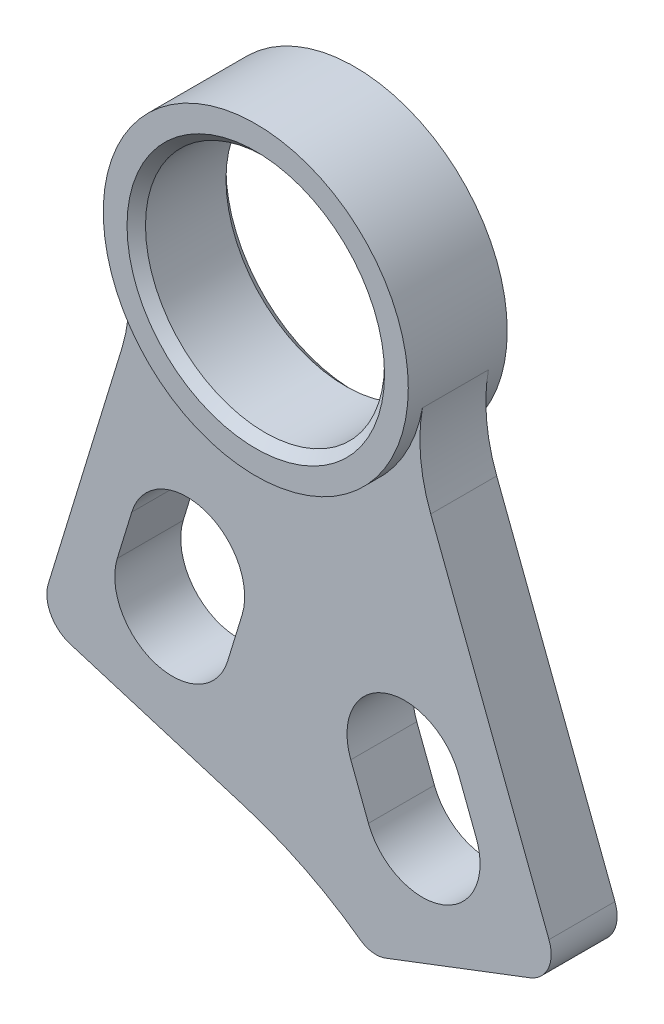
ISO-10303-21;
HEADER;
FILE_DESCRIPTION(('STEP AP214'),'2;1');
FILE_NAME('part.step','',(''),(''),'','','');
FILE_SCHEMA(('AUTOMOTIVE_DESIGN { 1 0 10303 214 1 1 1 1 }'));
ENDSEC;
DATA;
#1=APPLICATION_CONTEXT('core data for automotive mechanical design processes');
#2=APPLICATION_PROTOCOL_DEFINITION('international standard','automotive_design',2000,#1);
#3=PRODUCT_CONTEXT('',#1,'mechanical');
#4=PRODUCT('Part','Part','',(#3));
#5=PRODUCT_RELATED_PRODUCT_CATEGORY('part','',(#4));
#6=PRODUCT_DEFINITION_FORMATION('','',#4);
#7=PRODUCT_DEFINITION_CONTEXT('part definition',#1,'design');
#8=PRODUCT_DEFINITION('design','',#6,#7);
#9=PRODUCT_DEFINITION_SHAPE('','',#8);
#10=(LENGTH_UNIT() NAMED_UNIT(*) SI_UNIT(.MILLI.,.METRE.));
#11=(NAMED_UNIT(*) PLANE_ANGLE_UNIT() SI_UNIT($,.RADIAN.));
#12=(NAMED_UNIT(*) SI_UNIT($,.STERADIAN.) SOLID_ANGLE_UNIT());
#13=UNCERTAINTY_MEASURE_WITH_UNIT(LENGTH_MEASURE(1.E-05),#10,'distance_accuracy_value','');
#14=(GEOMETRIC_REPRESENTATION_CONTEXT(3) GLOBAL_UNCERTAINTY_ASSIGNED_CONTEXT((#13)) GLOBAL_UNIT_ASSIGNED_CONTEXT((#10,
#11,#12)) REPRESENTATION_CONTEXT('',''));
#15=CARTESIAN_POINT('',(0.,0.,0.));
#16=DIRECTION('',(0.,0.,1.));
#17=DIRECTION('',(1.,0.,0.));
#18=AXIS2_PLACEMENT_3D('',#15,#16,#17);
#19=CARTESIAN_POINT('',(0.,0.,4.7625));
#20=DIRECTION('',(0.,0.,-1.));
#21=DIRECTION('',(-1.,0.,0.));
#22=AXIS2_PLACEMENT_3D('',#19,#20,#21);
#23=CYLINDRICAL_SURFACE('',#22,11.5062);
#24=CARTESIAN_POINT('',(0.,0.,-3.87350000000004));
#25=DIRECTION('',(0.,0.,1.));
#26=DIRECTION('',(1.,0.,0.));
#27=AXIS2_PLACEMENT_3D('',#24,#25,#26);
#28=CIRCLE('',#27,11.5062);
#29=CARTESIAN_POINT('',(-11.5062,0.,-3.87350000000004));
#30=VERTEX_POINT('',#29);
#31=EDGE_CURVE('E53',#30,#30,#28,.F.);
#32=CARTESIAN_POINT('',(0.,0.,3.87349999999996));
#33=DIRECTION('',(0.,0.,1.));
#34=DIRECTION('',(1.,0.,0.));
#35=AXIS2_PLACEMENT_3D('',#32,#33,#34);
#36=CIRCLE('',#35,11.5062);
#37=CARTESIAN_POINT('',(-11.5062,0.,3.87349999999996));
#38=VERTEX_POINT('',#37);
#39=EDGE_CURVE('E438',#38,#38,#36,.T.);
#40=CARTESIAN_POINT('',(-11.5062,0.,-3.87350000000004));
#41=CARTESIAN_POINT('',(-11.5062,0.,-3.79280208333337));
#42=CARTESIAN_POINT('',(-11.5062,0.,-3.7121041666667));
#43=CARTESIAN_POINT('',(-11.5062,0.,-3.55070833333337));
#44=CARTESIAN_POINT('',(-11.5062,0.,-3.4700104166667));
#45=CARTESIAN_POINT('',(-11.5062,0.,-3.30861458333337));
#46=CARTESIAN_POINT('',(-11.5062,0.,-3.2279166666667));
#47=CARTESIAN_POINT('',(-11.5062,0.,-3.06652083333337));
#48=CARTESIAN_POINT('',(-11.5062,0.,-2.98582291666671));
#49=CARTESIAN_POINT('',(-11.5062,0.,-2.82442708333337));
#50=CARTESIAN_POINT('',(-11.5062,0.,-2.74372916666671));
#51=CARTESIAN_POINT('',(-11.5062,0.,-2.58233333333337));
#52=CARTESIAN_POINT('',(-11.5062,0.,-2.50163541666671));
#53=CARTESIAN_POINT('',(-11.5062,0.,-2.34023958333337));
#54=CARTESIAN_POINT('',(-11.5062,0.,-2.25954166666671));
#55=CARTESIAN_POINT('',(-11.5062,0.,-2.09814583333337));
#56=CARTESIAN_POINT('',(-11.5062,0.,-2.01744791666671));
#57=CARTESIAN_POINT('',(-11.5062,0.,-1.85605208333337));
#58=CARTESIAN_POINT('',(-11.5062,0.,-1.77535416666671));
#59=CARTESIAN_POINT('',(-11.5062,0.,-1.61395833333337));
#60=CARTESIAN_POINT('',(-11.5062,0.,-1.53326041666671));
#61=CARTESIAN_POINT('',(-11.5062,0.,-1.37186458333337));
#62=CARTESIAN_POINT('',(-11.5062,0.,-1.29116666666671));
#63=CARTESIAN_POINT('',(-11.5062,0.,-1.12977083333337));
#64=CARTESIAN_POINT('',(-11.5062,0.,-1.04907291666671));
#65=CARTESIAN_POINT('',(-11.5062,0.,-0.887677083333374));
#66=CARTESIAN_POINT('',(-11.5062,0.,-0.806979166666707));
#67=CARTESIAN_POINT('',(-11.5062,0.,-0.645583333333374));
#68=CARTESIAN_POINT('',(-11.5062,0.,-0.564885416666707));
#69=CARTESIAN_POINT('',(-11.5062,0.,-0.403489583333373));
#70=CARTESIAN_POINT('',(-11.5062,0.,-0.322791666666707));
#71=CARTESIAN_POINT('',(-11.5062,0.,-0.161395833333374));
#72=CARTESIAN_POINT('',(-11.5062,0.,-0.0806979166667072));
#73=CARTESIAN_POINT('',(-11.5062,0.,0.0806979166666259));
#74=CARTESIAN_POINT('',(-11.5062,0.,0.161395833333293));
#75=CARTESIAN_POINT('',(-11.5062,0.,0.322791666666626));
#76=CARTESIAN_POINT('',(-11.5062,0.,0.403489583333292));
#77=CARTESIAN_POINT('',(-11.5062,0.,0.564885416666625));
#78=CARTESIAN_POINT('',(-11.5062,0.,0.645583333333292));
#79=CARTESIAN_POINT('',(-11.5062,0.,0.806979166666625));
#80=CARTESIAN_POINT('',(-11.5062,0.,0.887677083333292));
#81=CARTESIAN_POINT('',(-11.5062,0.,1.04907291666662));
#82=CARTESIAN_POINT('',(-11.5062,0.,1.12977083333329));
#83=CARTESIAN_POINT('',(-11.5062,0.,1.29116666666662));
#84=CARTESIAN_POINT('',(-11.5062,0.,1.37186458333329));
#85=CARTESIAN_POINT('',(-11.5062,0.,1.53326041666662));
#86=CARTESIAN_POINT('',(-11.5062,0.,1.61395833333329));
#87=CARTESIAN_POINT('',(-11.5062,0.,1.77535416666662));
#88=CARTESIAN_POINT('',(-11.5062,0.,1.85605208333329));
#89=CARTESIAN_POINT('',(-11.5062,0.,2.01744791666662));
#90=CARTESIAN_POINT('',(-11.5062,0.,2.09814583333329));
#91=CARTESIAN_POINT('',(-11.5062,0.,2.25954166666662));
#92=CARTESIAN_POINT('',(-11.5062,0.,2.34023958333329));
#93=CARTESIAN_POINT('',(-11.5062,0.,2.50163541666662));
#94=CARTESIAN_POINT('',(-11.5062,0.,2.58233333333329));
#95=CARTESIAN_POINT('',(-11.5062,0.,2.74372916666662));
#96=CARTESIAN_POINT('',(-11.5062,0.,2.82442708333329));
#97=CARTESIAN_POINT('',(-11.5062,0.,2.98582291666662));
#98=CARTESIAN_POINT('',(-11.5062,0.,3.06652083333329));
#99=CARTESIAN_POINT('',(-11.5062,0.,3.22791666666662));
#100=CARTESIAN_POINT('',(-11.5062,0.,3.30861458333329));
#101=CARTESIAN_POINT('',(-11.5062,0.,3.47001041666662));
#102=CARTESIAN_POINT('',(-11.5062,0.,3.55070833333329));
#103=CARTESIAN_POINT('',(-11.5062,0.,3.71210416666662));
#104=CARTESIAN_POINT('',(-11.5062,0.,3.79280208333329));
#105=CARTESIAN_POINT('',(-11.5062,0.,3.87349999999996));
#106=B_SPLINE_CURVE_WITH_KNOTS('',3,(#40,#41,#42,#43,#44,#45,#46,#47,#48,#49,#50,#51,#52,#53,
#54,#55,#56,#57,#58,#59,#60,#61,#62,#63,#64,#65,#66,#67,#68,#69,#70,#71,#72,#73,#74,#75,#76,#77,
#78,#79,#80,#81,#82,#83,#84,#85,#86,#87,#88,#89,#90,#91,#92,#93,#94,#95,#96,#97,#98,#99,#100,
#101,#102,#103,#104,#105),.UNSPECIFIED.,.F.,.F.,(4,2,2,2,2,2,2,2,2,2,2,2,2,2,2,2,2,2,2,2,2,2,2,
2,2,2,2,2,2,2,2,2,4),(0.,0.24209375,0.4841875,0.726281249999999,0.968374999999999,1.21046875,
1.4525625,1.69465625,1.93675,2.17884375,2.4209375,2.66303125,2.905125,3.14721875,3.3893125,
3.63140625,3.8735,4.11559375,4.3576875,4.59978125,4.841875,5.08396875,5.32606249999999,
5.56815625,5.81024999999999,6.05234374999999,6.29443749999999,6.53653125,6.77862499999999,
7.02071874999999,7.26281249999999,7.50490624999999,7.74699999999999),.UNSPECIFIED.);
#107=EDGE_CURVE('BSEAM44',#30,#38,#106,.T.);
#108=ORIENTED_EDGE('',*,*,#31,.T.);
#109=ORIENTED_EDGE('',*,*,#39,.T.);
#110=ORIENTED_EDGE('',*,*,#107,.T.);
#111=ORIENTED_EDGE('',*,*,#107,.F.);
#112=EDGE_LOOP('',(#108,#110,#109,#111));
#113=FACE_BOUND('',#112,.T.);
#114=ADVANCED_FACE('F44',(#113),#23,.F.);
#115=CARTESIAN_POINT('',(0.,0.,4.7625));
#116=DIRECTION('',(0.,0.,-1.));
#117=DIRECTION('',(-1.,0.,0.));
#118=AXIS2_PLACEMENT_3D('',#115,#116,#117);
#119=CYLINDRICAL_SURFACE('',#118,14.6812);
#120=DIRECTION('',(0.,0.,-1.));
#121=VECTOR('',#120,1.);
#122=CARTESIAN_POINT('',(-14.2454230008891,-3.55043053244813,3.175));
#123=LINE('',#122,#121);
#124=CARTESIAN_POINT('',(-14.2454230008891,-3.55043053244813,3.175));
#125=VERTEX_POINT('',#124);
#126=CARTESIAN_POINT('',(-14.2454230008891,-3.55043053244813,-3.175));
#127=VERTEX_POINT('',#126);
#128=EDGE_CURVE('E363',#125,#127,#123,.T.);
#129=ORIENTED_EDGE('',*,*,#128,.F.);
#130=CARTESIAN_POINT('',(0.,0.,3.175));
#131=DIRECTION('',(0.,0.,1.));
#132=DIRECTION('',(1.,0.,0.));
#133=AXIS2_PLACEMENT_3D('',#130,#131,#132);
#134=CIRCLE('',#133,14.6812);
#135=CARTESIAN_POINT('',(14.4545745348815,-2.56961251077967,3.175));
#136=VERTEX_POINT('',#135);
#137=EDGE_CURVE('E288',#125,#136,#134,.T.);
#138=ORIENTED_EDGE('',*,*,#137,.T.);
#139=DIRECTION('',(0.,0.,-1.));
#140=VECTOR('',#139,1.);
#141=CARTESIAN_POINT('',(14.4545745348815,-2.56961251077968,3.175));
#142=LINE('',#141,#140);
#143=CARTESIAN_POINT('',(14.4545745348815,-2.56961251077968,-3.175));
#144=VERTEX_POINT('',#143);
#145=EDGE_CURVE('E368',#136,#144,#142,.T.);
#146=ORIENTED_EDGE('',*,*,#145,.T.);
#147=CARTESIAN_POINT('',(0.,0.,-3.175));
#148=DIRECTION('',(0.,0.,1.));
#149=DIRECTION('',(1.,0.,0.));
#150=AXIS2_PLACEMENT_3D('',#147,#148,#149);
#151=CIRCLE('',#150,14.6812);
#152=EDGE_CURVE('E349',#127,#144,#151,.T.);
#153=ORIENTED_EDGE('',*,*,#152,.F.);
#154=EDGE_LOOP('',(#129,#138,#146,#153));
#155=FACE_BOUND('',#154,.T.);
#156=CARTESIAN_POINT('',(0.,0.,4.7625));
#157=DIRECTION('',(0.,0.,1.));
#158=DIRECTION('',(1.,0.,0.));
#159=AXIS2_PLACEMENT_3D('',#156,#157,#158);
#160=CIRCLE('',#159,14.6812);
#161=CARTESIAN_POINT('',(14.6812,0.,4.7625));
#162=VERTEX_POINT('',#161);
#163=EDGE_CURVE('E403',#162,#162,#160,.T.);
#164=ORIENTED_EDGE('',*,*,#163,.F.);
#165=EDGE_LOOP('',(#164));
#166=FACE_BOUND('',#165,.T.);
#167=CARTESIAN_POINT('',(0.,0.,-4.7625));
#168=DIRECTION('',(0.,0.,1.));
#169=DIRECTION('',(1.,0.,0.));
#170=AXIS2_PLACEMENT_3D('',#167,#168,#169);
#171=CIRCLE('',#170,14.6812);
#172=CARTESIAN_POINT('',(14.6812,0.,-4.7625));
#173=VERTEX_POINT('',#172);
#174=EDGE_CURVE('E385',#173,#173,#171,.T.);
#175=ORIENTED_EDGE('',*,*,#174,.T.);
#176=EDGE_LOOP('',(#175));
#177=FACE_BOUND('',#176,.T.);
#178=ADVANCED_FACE('F461',(#155,#166,#177),#119,.T.);
#179=CARTESIAN_POINT('',(0.,0.,4.7625));
#180=DIRECTION('',(0.,0.,1.));
#181=DIRECTION('',(1.,0.,0.));
#182=AXIS2_PLACEMENT_3D('',#179,#180,#181);
#183=PLANE('',#182);
#184=CARTESIAN_POINT('',(0.,0.,4.7625));
#185=DIRECTION('',(0.,0.,1.));
#186=DIRECTION('',(1.,0.,0.));
#187=AXIS2_PLACEMENT_3D('',#184,#185,#186);
#188=CIRCLE('',#187,12.3952);
#189=CARTESIAN_POINT('',(12.3952,0.,4.7625));
#190=VERTEX_POINT('',#189);
#191=EDGE_CURVE('E11',#190,#190,#188,.F.);
#192=ORIENTED_EDGE('',*,*,#191,.T.);
#193=EDGE_LOOP('',(#192));
#194=FACE_BOUND('',#193,.T.);
#195=ORIENTED_EDGE('',*,*,#163,.T.);
#196=EDGE_LOOP('',(#195));
#197=FACE_BOUND('',#196,.T.);
#198=ADVANCED_FACE('F457',(#194,#197),#183,.T.);
#199=CARTESIAN_POINT('',(0.,0.,-4.7625));
#200=DIRECTION('',(0.,0.,1.));
#201=DIRECTION('',(1.,0.,0.));
#202=AXIS2_PLACEMENT_3D('',#199,#200,#201);
#203=PLANE('',#202);
#204=CARTESIAN_POINT('',(0.,0.,-4.7625));
#205=DIRECTION('',(0.,0.,1.));
#206=DIRECTION('',(1.,0.,0.));
#207=AXIS2_PLACEMENT_3D('',#204,#205,#206);
#208=CIRCLE('',#207,12.3952);
#209=CARTESIAN_POINT('',(12.3952,0.,-4.7625));
#210=VERTEX_POINT('',#209);
#211=EDGE_CURVE('E434',#210,#210,#208,.T.);
#212=ORIENTED_EDGE('',*,*,#211,.T.);
#213=EDGE_LOOP('',(#212));
#214=FACE_BOUND('',#213,.T.);
#215=ORIENTED_EDGE('',*,*,#174,.F.);
#216=EDGE_LOOP('',(#215));
#217=FACE_BOUND('',#216,.T.);
#218=ADVANCED_FACE('F453',(#214,#217),#203,.F.);
#219=CARTESIAN_POINT('',(-12.623119457076,-41.2936951019463,3.175));
#220=DIRECTION('',(0.29233718057146,0.9563153103739,0.));
#221=DIRECTION('',(-0.9563153103739,0.29233718057146,0.));
#222=AXIS2_PLACEMENT_3D('',#219,#220,#221);
#223=PLANE('',#222);
#224=DIRECTION('',(0.9563153103739,-0.29233718057146,0.));
#225=VECTOR('',#224,1.);
#226=CARTESIAN_POINT('',(-12.623119457076,-41.2936951019463,3.175));
#227=LINE('',#226,#225);
#228=CARTESIAN_POINT('',(-19.4547969555581,-39.2053113682394,3.175));
#229=VERTEX_POINT('',#228);
#230=CARTESIAN_POINT('',(-2.75514084815689,-44.3102493839675,3.175));
#231=VERTEX_POINT('',#230);
#232=EDGE_CURVE('E268',#229,#231,#227,.T.);
#233=ORIENTED_EDGE('',*,*,#232,.F.);
#234=DIRECTION('',(0.,0.,-1.));
#235=VECTOR('',#234,1.);
#236=CARTESIAN_POINT('',(-19.4547969555581,-39.2053113682394,3.175));
#237=LINE('',#236,#235);
#238=CARTESIAN_POINT('',(-19.4547969555581,-39.2053113682394,-3.175));
#239=VERTEX_POINT('',#238);
#240=EDGE_CURVE('E407',#229,#239,#237,.T.);
#241=ORIENTED_EDGE('',*,*,#240,.T.);
#242=DIRECTION('',(0.9563153103739,-0.29233718057146,0.));
#243=VECTOR('',#242,1.);
#244=CARTESIAN_POINT('',(-12.623119457076,-41.2936951019463,-3.175));
#245=LINE('',#244,#243);
#246=CARTESIAN_POINT('',(-2.75514084815689,-44.3102493839675,-3.175));
#247=VERTEX_POINT('',#246);
#248=EDGE_CURVE('E328',#239,#247,#245,.T.);
#249=ORIENTED_EDGE('',*,*,#248,.T.);
#250=DIRECTION('',(0.,0.,-1.));
#251=VECTOR('',#250,1.);
#252=CARTESIAN_POINT('',(-2.75514084815689,-44.3102493839675,3.175));
#253=LINE('',#252,#251);
#254=EDGE_CURVE('E381',#231,#247,#253,.T.);
#255=ORIENTED_EDGE('',*,*,#254,.F.);
#256=EDGE_LOOP('',(#233,#241,#249,#255));
#257=FACE_BOUND('',#256,.T.);
#258=ADVANCED_FACE('F456',(#257),#223,.F.);
#259=CARTESIAN_POINT('',(-13.8931874279295,-80.7458627092131,3.175));
#260=DIRECTION('',(0.,0.,-1.));
#261=DIRECTION('',(-1.,0.,0.));
#262=AXIS2_PLACEMENT_3D('',#259,#260,#261);
#263=CYLINDRICAL_SURFACE('',#262,38.1);
#264=CARTESIAN_POINT('',(-13.8931874279295,-80.7458627092131,-3.175));
#265=DIRECTION('',(0.,0.,1.));
#266=DIRECTION('',(1.,0.,0.));
#267=AXIS2_PLACEMENT_3D('',#264,#265,#266);
#268=CIRCLE('',#267,38.1);
#269=CARTESIAN_POINT('',(8.46862094202407,-49.8985042092448,-3.175));
#270=VERTEX_POINT('',#269);
#271=EDGE_CURVE('E331',#247,#270,#268,.F.);
#272=ORIENTED_EDGE('',*,*,#271,.T.);
#273=DIRECTION('',(0.,0.,-1.));
#274=VECTOR('',#273,1.);
#275=CARTESIAN_POINT('',(8.46862094202407,-49.8985042092448,3.175));
#276=LINE('',#275,#274);
#277=CARTESIAN_POINT('',(8.46862094202407,-49.8985042092448,3.175));
#278=VERTEX_POINT('',#277);
#279=EDGE_CURVE('E378',#278,#270,#276,.T.);
#280=ORIENTED_EDGE('',*,*,#279,.F.);
#281=CARTESIAN_POINT('',(-13.8931874279295,-80.7458627092131,3.175));
#282=DIRECTION('',(0.,0.,1.));
#283=DIRECTION('',(1.,0.,0.));
#284=AXIS2_PLACEMENT_3D('',#281,#282,#283);
#285=CIRCLE('',#284,38.1);
#286=EDGE_CURVE('E271',#231,#278,#285,.F.);
#287=ORIENTED_EDGE('',*,*,#286,.F.);
#288=ORIENTED_EDGE('',*,*,#254,.T.);
#289=EDGE_LOOP('',(#272,#280,#287,#288));
#290=FACE_BOUND('',#289,.T.);
#291=ADVANCED_FACE('F516',(#290),#263,.F.);
#292=CARTESIAN_POINT('',(9.97829056036936,-47.8159660189891,3.175));
#293=DIRECTION('',(0.,0.,-1.));
#294=DIRECTION('',(-1.,0.,0.));
#295=AXIS2_PLACEMENT_3D('',#292,#293,#294);
#296=CYLINDRICAL_SURFACE('',#295,2.57217178089416);
#297=CARTESIAN_POINT('',(9.97829056036936,-47.8159660189891,-3.175));
#298=DIRECTION('',(0.,0.,1.));
#299=DIRECTION('',(1.,0.,0.));
#300=AXIS2_PLACEMENT_3D('',#297,#298,#299);
#301=CIRCLE('',#300,2.57217178089416);
#302=CARTESIAN_POINT('',(10.8964085832782,-50.2186992473018,-3.175));
#303=VERTEX_POINT('',#302);
#304=EDGE_CURVE('E335',#303,#270,#301,.F.);
#305=ORIENTED_EDGE('',*,*,#304,.F.);
#306=DIRECTION('',(0.,0.,-1.));
#307=VECTOR('',#306,1.);
#308=CARTESIAN_POINT('',(10.8964085832782,-50.2186992473018,3.175));
#309=LINE('',#308,#307);
#310=CARTESIAN_POINT('',(10.8964085832782,-50.2186992473018,3.175));
#311=VERTEX_POINT('',#310);
#312=EDGE_CURVE('E375',#311,#303,#309,.T.);
#313=ORIENTED_EDGE('',*,*,#312,.F.);
#314=CARTESIAN_POINT('',(9.97829056036936,-47.8159660189891,3.175));
#315=DIRECTION('',(0.,0.,1.));
#316=DIRECTION('',(1.,0.,0.));
#317=AXIS2_PLACEMENT_3D('',#314,#315,#316);
#318=CIRCLE('',#317,2.57217178089416);
#319=EDGE_CURVE('E274',#311,#278,#318,.F.);
#320=ORIENTED_EDGE('',*,*,#319,.T.);
#321=ORIENTED_EDGE('',*,*,#279,.T.);
#322=EDGE_LOOP('',(#305,#313,#320,#321));
#323=FACE_BOUND('',#322,.T.);
#324=ADVANCED_FACE('F519',(#323),#296,.T.);
#325=CARTESIAN_POINT('',(18.1326907907967,-47.4536144533306,3.175));
#326=DIRECTION('',(-0.356942732102297,0.934126268766352,0.));
#327=DIRECTION('',(-0.934126268766353,-0.356942732102297,0.));
#328=AXIS2_PLACEMENT_3D('',#325,#326,#327);
#329=PLANE('',#328);
#330=DIRECTION('',(0.934126268766353,0.356942732102297,0.));
#331=VECTOR('',#330,1.);
#332=CARTESIAN_POINT('',(18.1326907907967,-47.4536144533306,-3.175));
#333=LINE('',#332,#331);
#334=CARTESIAN_POINT('',(24.8058553232948,-44.9037048108754,-3.175));
#335=VERTEX_POINT('',#334);
#336=EDGE_CURVE('E339',#303,#335,#333,.T.);
#337=ORIENTED_EDGE('',*,*,#336,.T.);
#338=DIRECTION('',(0.,0.,-1.));
#339=VECTOR('',#338,1.);
#340=CARTESIAN_POINT('',(24.8058553232948,-44.9037048108754,3.175));
#341=LINE('',#340,#339);
#342=CARTESIAN_POINT('',(24.8058553232948,-44.9037048108754,3.175));
#343=VERTEX_POINT('',#342);
#344=EDGE_CURVE('E74',#335,#343,#341,.F.);
#345=ORIENTED_EDGE('',*,*,#344,.T.);
#346=DIRECTION('',(0.934126268766353,0.356942732102297,0.));
#347=VECTOR('',#346,1.);
#348=CARTESIAN_POINT('',(18.1326907907967,-47.4536144533306,3.175));
#349=LINE('',#348,#347);
#350=EDGE_CURVE('E278',#311,#343,#349,.T.);
#351=ORIENTED_EDGE('',*,*,#350,.F.);
#352=ORIENTED_EDGE('',*,*,#312,.T.);
#353=EDGE_LOOP('',(#337,#345,#351,#352));
#354=FACE_BOUND('',#353,.T.);
#355=ADVANCED_FACE('F520',(#354),#329,.F.);
#356=CARTESIAN_POINT('',(9.63901543583132,3.68320281688001,3.175));
#357=DIRECTION('',(-0.934126268766353,-0.356942732102297,0.));
#358=DIRECTION('',(0.356942732102297,-0.934126268766353,0.));
#359=AXIS2_PLACEMENT_3D('',#356,#357,#358);
#360=PLANE('',#359);
#361=DIRECTION('',(-0.356942732102297,0.934126268766353,0.));
#362=VECTOR('',#361,1.);
#363=CARTESIAN_POINT('',(9.63901543583132,3.68320281688001,3.175));
#364=LINE('',#363,#362);
#365=CARTESIAN_POINT('',(26.6384130522032,-40.8045607331175,3.175));
#366=VERTEX_POINT('',#365);
#367=CARTESIAN_POINT('',(15.2552665308469,-11.0146386237978,3.175));
#368=VERTEX_POINT('',#367);
#369=EDGE_CURVE('E281',#366,#368,#364,.T.);
#370=ORIENTED_EDGE('',*,*,#369,.F.);
#371=DIRECTION('',(0.,0.,-1.));
#372=VECTOR('',#371,1.);
#373=CARTESIAN_POINT('',(26.6384130522032,-40.8045607331175,3.175));
#374=LINE('',#373,#372);
#375=CARTESIAN_POINT('',(26.6384130522032,-40.8045607331175,-3.175));
#376=VERTEX_POINT('',#375);
#377=EDGE_CURVE('E428',#366,#376,#374,.T.);
#378=ORIENTED_EDGE('',*,*,#377,.T.);
#379=DIRECTION('',(-0.356942732102297,0.934126268766353,0.));
#380=VECTOR('',#379,1.);
#381=CARTESIAN_POINT('',(9.63901543583132,3.68320281688001,-3.175));
#382=LINE('',#381,#380);
#383=CARTESIAN_POINT('',(15.2552665308469,-11.0146386237978,-3.175));
#384=VERTEX_POINT('',#383);
#385=EDGE_CURVE('E342',#376,#384,#382,.T.);
#386=ORIENTED_EDGE('',*,*,#385,.T.);
#387=DIRECTION('',(0.,0.,-1.));
#388=VECTOR('',#387,1.);
#389=CARTESIAN_POINT('',(15.2552665308469,-11.0146386237978,3.175));
#390=LINE('',#389,#388);
#391=EDGE_CURVE('E371',#368,#384,#390,.T.);
#392=ORIENTED_EDGE('',*,*,#391,.F.);
#393=EDGE_LOOP('',(#370,#378,#386,#392));
#394=FACE_BOUND('',#393,.T.);
#395=ADVANCED_FACE('F486',(#394),#360,.F.);
#396=CARTESIAN_POINT('',(30.0845210475113,-5.34817275167437,3.175));
#397=DIRECTION('',(0.,0.,-1.));
#398=DIRECTION('',(-1.,0.,0.));
#399=AXIS2_PLACEMENT_3D('',#396,#397,#398);
#400=CYLINDRICAL_SURFACE('',#399,15.8749999999984);
#401=CARTESIAN_POINT('',(30.0845210475113,-5.34817275167437,-3.175));
#402=DIRECTION('',(0.,0.,1.));
#403=DIRECTION('',(1.,0.,0.));
#404=AXIS2_PLACEMENT_3D('',#401,#402,#403);
#405=CIRCLE('',#404,15.8749999999984);
#406=EDGE_CURVE('E345',#384,#144,#405,.F.);
#407=ORIENTED_EDGE('',*,*,#406,.T.);
#408=ORIENTED_EDGE('',*,*,#145,.F.);
#409=CARTESIAN_POINT('',(30.0845210475113,-5.34817275167437,3.175));
#410=DIRECTION('',(0.,0.,1.));
#411=DIRECTION('',(1.,0.,0.));
#412=AXIS2_PLACEMENT_3D('',#409,#410,#411);
#413=CIRCLE('',#412,15.8749999999984);
#414=EDGE_CURVE('E284',#368,#136,#413,.F.);
#415=ORIENTED_EDGE('',*,*,#414,.F.);
#416=ORIENTED_EDGE('',*,*,#391,.T.);
#417=EDGE_LOOP('',(#407,#408,#415,#416));
#418=FACE_BOUND('',#417,.T.);
#419=ADVANCED_FACE('F494',(#418),#400,.F.);
#420=CARTESIAN_POINT('',(-29.6492108478697,-7.38956389365897,3.175));
#421=DIRECTION('',(0.,0.,-1.));
#422=DIRECTION('',(-1.,0.,0.));
#423=AXIS2_PLACEMENT_3D('',#420,#421,#422);
#424=CYLINDRICAL_SURFACE('',#423,15.8749999999984);
#425=CARTESIAN_POINT('',(-29.6492108478697,-7.38956389365897,-3.175));
#426=DIRECTION('',(0.,0.,1.));
#427=DIRECTION('',(1.,0.,0.));
#428=AXIS2_PLACEMENT_3D('',#425,#426,#427);
#429=CIRCLE('',#428,15.8749999999984);
#430=CARTESIAN_POINT('',(-14.4677052956855,-12.0304166352304,-3.175));
#431=VERTEX_POINT('',#430);
#432=EDGE_CURVE('E353',#431,#127,#429,.T.);
#433=ORIENTED_EDGE('',*,*,#432,.F.);
#434=DIRECTION('',(0.,0.,-1.));
#435=VECTOR('',#434,1.);
#436=CARTESIAN_POINT('',(-14.4677052956855,-12.0304166352304,3.175));
#437=LINE('',#436,#435);
#438=CARTESIAN_POINT('',(-14.4677052956855,-12.0304166352304,3.175));
#439=VERTEX_POINT('',#438);
#440=EDGE_CURVE('E360',#439,#431,#437,.T.);
#441=ORIENTED_EDGE('',*,*,#440,.F.);
#442=CARTESIAN_POINT('',(-29.6492108478697,-7.38956389365897,3.175));
#443=DIRECTION('',(0.,0.,1.));
#444=DIRECTION('',(1.,0.,0.));
#445=AXIS2_PLACEMENT_3D('',#442,#443,#444);
#446=CIRCLE('',#445,15.8749999999984);
#447=EDGE_CURVE('E291',#439,#125,#446,.T.);
#448=ORIENTED_EDGE('',*,*,#447,.T.);
#449=ORIENTED_EDGE('',*,*,#128,.T.);
#450=EDGE_LOOP('',(#433,#441,#448,#449));
#451=FACE_BOUND('',#450,.T.);
#452=ADVANCED_FACE('F500',(#451),#424,.F.);
#453=CARTESIAN_POINT('',(12.7495482122783,-33.3658226624966,3.175));
#454=DIRECTION('',(0.,0.,-1.));
#455=DIRECTION('',(-1.,0.,0.));
#456=AXIS2_PLACEMENT_3D('',#453,#454,#455);
#457=CYLINDRICAL_SURFACE('',#456,5.5562499999984);
#458=CARTESIAN_POINT('',(12.7495482122783,-33.3658226624966,-3.175));
#459=DIRECTION('',(0.,0.,1.));
#460=DIRECTION('',(1.,0.,0.));
#461=AXIS2_PLACEMENT_3D('',#458,#459,#460);
#462=CIRCLE('',#461,5.5562499999984);
#463=CARTESIAN_POINT('',(17.9397872931099,-31.3825596072538,-3.175));
#464=VERTEX_POINT('',#463);
#465=CARTESIAN_POINT('',(7.55930913144678,-35.3490857177394,-3.175));
#466=VERTEX_POINT('',#465);
#467=EDGE_CURVE('E313',#464,#466,#462,.T.);
#468=ORIENTED_EDGE('',*,*,#467,.F.);
#469=DIRECTION('',(0.,0.,-1.));
#470=VECTOR('',#469,1.);
#471=CARTESIAN_POINT('',(17.9397872931099,-31.3825596072538,3.175));
#472=LINE('',#471,#470);
#473=CARTESIAN_POINT('',(17.9397872931099,-31.3825596072538,3.175));
#474=VERTEX_POINT('',#473);
#475=EDGE_CURVE('E364',#474,#464,#472,.T.);
#476=ORIENTED_EDGE('',*,*,#475,.F.);
#477=CARTESIAN_POINT('',(12.7495482122783,-33.3658226624966,3.175));
#478=DIRECTION('',(0.,0.,1.));
#479=DIRECTION('',(1.,0.,0.));
#480=AXIS2_PLACEMENT_3D('',#477,#478,#479);
#481=CIRCLE('',#480,5.5562499999984);
#482=CARTESIAN_POINT('',(7.55930913144678,-35.3490857177394,3.175));
#483=VERTEX_POINT('',#482);
#484=EDGE_CURVE('E254',#474,#483,#481,.T.);
#485=ORIENTED_EDGE('',*,*,#484,.T.);
#486=DIRECTION('',(0.,0.,-1.));
#487=VECTOR('',#486,1.);
#488=CARTESIAN_POINT('',(7.55930913144678,-35.3490857177394,3.175));
#489=LINE('',#488,#487);
#490=EDGE_CURVE('E227',#483,#466,#489,.T.);
#491=ORIENTED_EDGE('',*,*,#490,.T.);
#492=EDGE_LOOP('',(#468,#476,#485,#491));
#493=FACE_BOUND('',#492,.T.);
#494=ADVANCED_FACE('F548',(#493),#457,.F.);
#495=CARTESIAN_POINT('',(5.19023908083157,1.98326305524282,3.175));
#496=DIRECTION('',(-0.934126268766353,-0.356942732102297,0.));
#497=DIRECTION('',(0.356942732102297,-0.934126268766353,0.));
#498=AXIS2_PLACEMENT_3D('',#495,#496,#497);
#499=PLANE('',#498);
#500=DIRECTION('',(-0.356942732102297,0.934126268766353,0.));
#501=VECTOR('',#500,1.);
#502=CARTESIAN_POINT('',(5.19023908083157,1.98326305524282,-3.175));
#503=LINE('',#502,#501);
#504=CARTESIAN_POINT('',(19.6397270547482,-35.8313359622565,-3.175));
#505=VERTEX_POINT('',#504);
#506=EDGE_CURVE('E316',#505,#464,#503,.T.);
#507=ORIENTED_EDGE('',*,*,#506,.F.);
#508=DIRECTION('',(0.,0.,-1.));
#509=VECTOR('',#508,1.);
#510=CARTESIAN_POINT('',(19.6397270547482,-35.8313359622565,3.175));
#511=LINE('',#510,#509);
#512=CARTESIAN_POINT('',(19.6397270547482,-35.8313359622565,3.175));
#513=VERTEX_POINT('',#512);
#514=EDGE_CURVE('E391',#513,#505,#511,.T.);
#515=ORIENTED_EDGE('',*,*,#514,.F.);
#516=DIRECTION('',(-0.356942732102297,0.934126268766353,0.));
#517=VECTOR('',#516,1.);
#518=CARTESIAN_POINT('',(5.19023908083157,1.98326305524282,3.175));
#519=LINE('',#518,#517);
#520=EDGE_CURVE('E258',#513,#474,#519,.T.);
#521=ORIENTED_EDGE('',*,*,#520,.T.);
#522=ORIENTED_EDGE('',*,*,#475,.T.);
#523=EDGE_LOOP('',(#507,#515,#521,#522));
#524=FACE_BOUND('',#523,.T.);
#525=ADVANCED_FACE('F544',(#524),#499,.T.);
#526=CARTESIAN_POINT('',(14.4494879739167,-37.8145990174993,3.175));
#527=DIRECTION('',(0.,0.,-1.));
#528=DIRECTION('',(-1.,0.,0.));
#529=AXIS2_PLACEMENT_3D('',#526,#527,#528);
#530=CYLINDRICAL_SURFACE('',#529,5.5562499999984);
#531=CARTESIAN_POINT('',(14.4494879739167,-37.8145990174993,-3.175));
#532=DIRECTION('',(0.,0.,1.));
#533=DIRECTION('',(1.,0.,0.));
#534=AXIS2_PLACEMENT_3D('',#531,#532,#533);
#535=CIRCLE('',#534,5.5562499999984);
#536=CARTESIAN_POINT('',(9.25924889308512,-39.7978620727422,-3.175));
#537=VERTEX_POINT('',#536);
#538=EDGE_CURVE('E320',#537,#505,#535,.T.);
#539=ORIENTED_EDGE('',*,*,#538,.F.);
#540=DIRECTION('',(0.,0.,-1.));
#541=VECTOR('',#540,1.);
#542=CARTESIAN_POINT('',(9.25924889308512,-39.7978620727422,3.175));
#543=LINE('',#542,#541);
#544=CARTESIAN_POINT('',(9.25924889308512,-39.7978620727422,3.175));
#545=VERTEX_POINT('',#544);
#546=EDGE_CURVE('E388',#545,#537,#543,.T.);
#547=ORIENTED_EDGE('',*,*,#546,.F.);
#548=CARTESIAN_POINT('',(14.4494879739167,-37.8145990174993,3.175));
#549=DIRECTION('',(0.,0.,1.));
#550=DIRECTION('',(1.,0.,0.));
#551=AXIS2_PLACEMENT_3D('',#548,#549,#550);
#552=CIRCLE('',#551,5.5562499999984);
#553=EDGE_CURVE('E261',#545,#513,#552,.T.);
#554=ORIENTED_EDGE('',*,*,#553,.T.);
#555=ORIENTED_EDGE('',*,*,#514,.T.);
#556=EDGE_LOOP('',(#539,#547,#554,#555));
#557=FACE_BOUND('',#556,.T.);
#558=ADVANCED_FACE('F541',(#557),#530,.F.);
#559=CARTESIAN_POINT('',(-8.21430935258181,-26.871264827367,3.175));
#560=DIRECTION('',(0.,0.,-1.));
#561=DIRECTION('',(-1.,0.,0.));
#562=AXIS2_PLACEMENT_3D('',#559,#560,#561);
#563=CYLINDRICAL_SURFACE('',#562,5.5562499999984);
#564=CARTESIAN_POINT('',(-8.21430935258181,-26.871264827367,-3.175));
#565=DIRECTION('',(0.,0.,1.));
#566=DIRECTION('',(1.,0.,0.));
#567=AXIS2_PLACEMENT_3D('',#564,#565,#566);
#568=CIRCLE('',#567,5.5562499999984);
#569=CARTESIAN_POINT('',(-2.90078240931836,-28.4955632869167,-3.175));
#570=VERTEX_POINT('',#569);
#571=CARTESIAN_POINT('',(-13.5278362958453,-25.2469663678173,-3.175));
#572=VERTEX_POINT('',#571);
#573=EDGE_CURVE('E221',#570,#572,#568,.T.);
#574=ORIENTED_EDGE('',*,*,#573,.F.);
#575=DIRECTION('',(0.,0.,-1.));
#576=VECTOR('',#575,1.);
#577=CARTESIAN_POINT('',(-2.90078240931836,-28.4955632869167,3.175));
#578=LINE('',#577,#576);
#579=CARTESIAN_POINT('',(-2.90078240931836,-28.4955632869167,3.175));
#580=VERTEX_POINT('',#579);
#581=EDGE_CURVE('E216',#580,#570,#578,.T.);
#582=ORIENTED_EDGE('',*,*,#581,.F.);
#583=CARTESIAN_POINT('',(-8.21430935258181,-26.871264827367,3.175));
#584=DIRECTION('',(0.,0.,1.));
#585=DIRECTION('',(1.,0.,0.));
#586=AXIS2_PLACEMENT_3D('',#583,#584,#585);
#587=CIRCLE('',#586,5.5562499999984);
#588=CARTESIAN_POINT('',(-13.5278362958453,-25.2469663678173,3.175));
#589=VERTEX_POINT('',#588);
#590=EDGE_CURVE('E219',#580,#589,#587,.T.);
#591=ORIENTED_EDGE('',*,*,#590,.T.);
#592=DIRECTION('',(0.,0.,-1.));
#593=VECTOR('',#592,1.);
#594=CARTESIAN_POINT('',(-13.5278362958453,-25.2469663678173,3.175));
#595=LINE('',#594,#593);
#596=EDGE_CURVE('E299',#589,#572,#595,.T.);
#597=ORIENTED_EDGE('',*,*,#596,.T.);
#598=EDGE_LOOP('',(#574,#582,#591,#597));
#599=FACE_BOUND('',#598,.T.);
#600=ADVANCED_FACE('F218',(#599),#563,.F.);
#601=CARTESIAN_POINT('',(5.31352694326345,-1.62429845954971,3.175));
#602=DIRECTION('',(-0.9563153103739,0.29233718057146,0.));
#603=DIRECTION('',(-0.29233718057146,-0.9563153103739,0.));
#604=AXIS2_PLACEMENT_3D('',#601,#602,#603);
#605=PLANE('',#604);
#606=DIRECTION('',(0.29233718057146,0.9563153103739,0.));
#607=VECTOR('',#606,1.);
#608=CARTESIAN_POINT('',(5.31352694326345,-1.62429845954971,-3.175));
#609=LINE('',#608,#607);
#610=CARTESIAN_POINT('',(-4.29303823179089,-33.0500149525755,-3.175));
#611=VERTEX_POINT('',#610);
#612=EDGE_CURVE('E302',#611,#570,#609,.T.);
#613=ORIENTED_EDGE('',*,*,#612,.F.);
#614=DIRECTION('',(0.,0.,-1.));
#615=VECTOR('',#614,1.);
#616=CARTESIAN_POINT('',(-4.29303823179089,-33.0500149525755,3.175));
#617=LINE('',#616,#615);
#618=CARTESIAN_POINT('',(-4.29303823179089,-33.0500149525755,3.175));
#619=VERTEX_POINT('',#618);
#620=EDGE_CURVE('E228',#619,#611,#617,.T.);
#621=ORIENTED_EDGE('',*,*,#620,.F.);
#622=DIRECTION('',(0.29233718057146,0.9563153103739,0.));
#623=VECTOR('',#622,1.);
#624=CARTESIAN_POINT('',(5.31352694326345,-1.62429845954971,3.175));
#625=LINE('',#624,#623);
#626=EDGE_CURVE('E235',#619,#580,#625,.T.);
#627=ORIENTED_EDGE('',*,*,#626,.T.);
#628=ORIENTED_EDGE('',*,*,#581,.T.);
#629=EDGE_LOOP('',(#613,#621,#627,#628));
#630=FACE_BOUND('',#629,.T.);
#631=ADVANCED_FACE('F243',(#630),#605,.T.);
#632=CARTESIAN_POINT('',(-9.60656517505433,-31.4257164930258,3.175));
#633=DIRECTION('',(0.,0.,-1.));
#634=DIRECTION('',(-1.,0.,0.));
#635=AXIS2_PLACEMENT_3D('',#632,#633,#634);
#636=CYLINDRICAL_SURFACE('',#635,5.5562499999984);
#637=CARTESIAN_POINT('',(-9.60656517505433,-31.4257164930258,-3.175));
#638=DIRECTION('',(0.,0.,1.));
#639=DIRECTION('',(1.,0.,0.));
#640=AXIS2_PLACEMENT_3D('',#637,#638,#639);
#641=CIRCLE('',#640,5.5562499999984);
#642=CARTESIAN_POINT('',(-14.9200921183178,-29.8014180334761,-3.175));
#643=VERTEX_POINT('',#642);
#644=EDGE_CURVE('E305',#643,#611,#641,.T.);
#645=ORIENTED_EDGE('',*,*,#644,.F.);
#646=DIRECTION('',(0.,0.,-1.));
#647=VECTOR('',#646,1.);
#648=CARTESIAN_POINT('',(-14.9200921183178,-29.8014180334761,3.175));
#649=LINE('',#648,#647);
#650=CARTESIAN_POINT('',(-14.9200921183178,-29.8014180334761,3.175));
#651=VERTEX_POINT('',#650);
#652=EDGE_CURVE('E398',#651,#643,#649,.T.);
#653=ORIENTED_EDGE('',*,*,#652,.F.);
#654=CARTESIAN_POINT('',(-9.60656517505433,-31.4257164930258,3.175));
#655=DIRECTION('',(0.,0.,1.));
#656=DIRECTION('',(1.,0.,0.));
#657=AXIS2_PLACEMENT_3D('',#654,#655,#656);
#658=CIRCLE('',#657,5.5562499999984);
#659=EDGE_CURVE('E245',#651,#619,#658,.T.);
#660=ORIENTED_EDGE('',*,*,#659,.T.);
#661=ORIENTED_EDGE('',*,*,#620,.T.);
#662=EDGE_LOOP('',(#645,#653,#660,#661));
#663=FACE_BOUND('',#662,.T.);
#664=ADVANCED_FACE('F539',(#663),#636,.F.);
#665=CARTESIAN_POINT('',(-5.19023908083154,-1.98326305524281,3.175));
#666=DIRECTION('',(-0.934126268766353,-0.356942732102297,0.));
#667=DIRECTION('',(0.356942732102297,-0.934126268766353,0.));
#668=AXIS2_PLACEMENT_3D('',#665,#666,#667);
#669=PLANE('',#668);
#670=DIRECTION('',(-0.356942732102297,0.934126268766353,0.));
#671=VECTOR('',#670,1.);
#672=CARTESIAN_POINT('',(-5.19023908083154,-1.98326305524281,-3.175));
#673=LINE('',#672,#671);
#674=EDGE_CURVE('E324',#537,#466,#673,.T.);
#675=ORIENTED_EDGE('',*,*,#674,.T.);
#676=ORIENTED_EDGE('',*,*,#490,.F.);
#677=DIRECTION('',(-0.356942732102297,0.934126268766353,0.));
#678=VECTOR('',#677,1.);
#679=CARTESIAN_POINT('',(-5.19023908083154,-1.98326305524281,3.175));
#680=LINE('',#679,#678);
#681=EDGE_CURVE('E265',#545,#483,#680,.T.);
#682=ORIENTED_EDGE('',*,*,#681,.F.);
#683=ORIENTED_EDGE('',*,*,#546,.T.);
#684=EDGE_LOOP('',(#675,#676,#682,#683));
#685=FACE_BOUND('',#684,.T.);
#686=ADVANCED_FACE('F535',(#685),#669,.F.);
#687=CARTESIAN_POINT('',(-5.31352694326345,1.62429845954971,3.175));
#688=DIRECTION('',(-0.9563153103739,0.29233718057146,0.));
#689=DIRECTION('',(-0.29233718057146,-0.9563153103739,0.));
#690=AXIS2_PLACEMENT_3D('',#687,#688,#689);
#691=PLANE('',#690);
#692=DIRECTION('',(0.29233718057146,0.9563153103739,0.));
#693=VECTOR('',#692,1.);
#694=CARTESIAN_POINT('',(-5.31352694326345,1.62429845954971,-3.175));
#695=LINE('',#694,#693);
#696=EDGE_CURVE('E309',#643,#572,#695,.T.);
#697=ORIENTED_EDGE('',*,*,#696,.T.);
#698=ORIENTED_EDGE('',*,*,#596,.F.);
#699=DIRECTION('',(0.29233718057146,0.9563153103739,0.));
#700=VECTOR('',#699,1.);
#701=CARTESIAN_POINT('',(-5.31352694326345,1.62429845954971,3.175));
#702=LINE('',#701,#700);
#703=EDGE_CURVE('E238',#651,#589,#702,.T.);
#704=ORIENTED_EDGE('',*,*,#703,.F.);
#705=ORIENTED_EDGE('',*,*,#652,.T.);
#706=EDGE_LOOP('',(#697,#698,#704,#705));
#707=FACE_BOUND('',#706,.T.);
#708=ADVANCED_FACE('F538',(#707),#691,.F.);
#709=CARTESIAN_POINT('',(-9.86797860891914,3.01655428202129,3.175));
#710=DIRECTION('',(0.9563153103739,-0.292337180571461,0.));
#711=DIRECTION('',(0.292337180571461,0.9563153103739,0.));
#712=AXIS2_PLACEMENT_3D('',#709,#710,#711);
#713=PLANE('',#712);
#714=DIRECTION('',(-0.292337180571461,-0.9563153103739,0.));
#715=VECTOR('',#714,1.);
#716=CARTESIAN_POINT('',(-9.86797860891914,3.01655428202129,-3.175));
#717=LINE('',#716,#715);
#718=CARTESIAN_POINT('',(-21.5629275176808,-35.2408397094878,-3.175));
#719=VERTEX_POINT('',#718);
#720=EDGE_CURVE('E241',#431,#719,#717,.T.);
#721=ORIENTED_EDGE('',*,*,#720,.T.);
#722=DIRECTION('',(0.,0.,-1.));
#723=VECTOR('',#722,1.);
#724=CARTESIAN_POINT('',(-21.5629275176808,-35.2408397094878,3.175));
#725=LINE('',#724,#723);
#726=CARTESIAN_POINT('',(-21.5629275176808,-35.2408397094878,3.175));
#727=VERTEX_POINT('',#726);
#728=EDGE_CURVE('E420',#719,#727,#725,.F.);
#729=ORIENTED_EDGE('',*,*,#728,.T.);
#730=DIRECTION('',(-0.292337180571461,-0.9563153103739,0.));
#731=VECTOR('',#730,1.);
#732=CARTESIAN_POINT('',(-9.86797860891914,3.01655428202129,3.175));
#733=LINE('',#732,#731);
#734=EDGE_CURVE('E295',#439,#727,#733,.T.);
#735=ORIENTED_EDGE('',*,*,#734,.F.);
#736=ORIENTED_EDGE('',*,*,#440,.T.);
#737=EDGE_LOOP('',(#721,#729,#735,#736));
#738=FACE_BOUND('',#737,.T.);
#739=ADVANCED_FACE('F504',(#738),#713,.F.);
#740=CARTESIAN_POINT('',(0.,0.,3.175));
#741=DIRECTION('',(0.,0.,1.));
#742=DIRECTION('',(1.,0.,0.));
#743=AXIS2_PLACEMENT_3D('',#740,#741,#742);
#744=PLANE('',#743);
#745=ORIENTED_EDGE('',*,*,#590,.F.);
#746=ORIENTED_EDGE('',*,*,#626,.F.);
#747=ORIENTED_EDGE('',*,*,#659,.F.);
#748=ORIENTED_EDGE('',*,*,#703,.T.);
#749=EDGE_LOOP('',(#745,#746,#747,#748));
#750=FACE_BOUND('',#749,.T.);
#751=ORIENTED_EDGE('',*,*,#484,.F.);
#752=ORIENTED_EDGE('',*,*,#520,.F.);
#753=ORIENTED_EDGE('',*,*,#553,.F.);
#754=ORIENTED_EDGE('',*,*,#681,.T.);
#755=EDGE_LOOP('',(#751,#752,#753,#754));
#756=FACE_BOUND('',#755,.T.);
#757=ORIENTED_EDGE('',*,*,#734,.T.);
#758=CARTESIAN_POINT('',(-18.5266264072437,-36.1690102578022,3.175));
#759=DIRECTION('',(0.,0.,1.));
#760=DIRECTION('',(1.,0.,0.));
#761=AXIS2_PLACEMENT_3D('',#758,#759,#760);
#762=CIRCLE('',#761,3.175);
#763=EDGE_CURVE('E425',#727,#229,#762,.T.);
#764=ORIENTED_EDGE('',*,*,#763,.T.);
#765=ORIENTED_EDGE('',*,*,#232,.T.);
#766=ORIENTED_EDGE('',*,*,#286,.T.);
#767=ORIENTED_EDGE('',*,*,#319,.F.);
#768=ORIENTED_EDGE('',*,*,#350,.T.);
#769=CARTESIAN_POINT('',(23.67256214887,-41.9378539075423,3.175));
#770=DIRECTION('',(0.,0.,1.));
#771=DIRECTION('',(1.,0.,0.));
#772=AXIS2_PLACEMENT_3D('',#769,#770,#771);
#773=CIRCLE('',#772,3.175);
#774=EDGE_CURVE('E63',#343,#366,#773,.T.);
#775=ORIENTED_EDGE('',*,*,#774,.T.);
#776=ORIENTED_EDGE('',*,*,#369,.T.);
#777=ORIENTED_EDGE('',*,*,#414,.T.);
#778=ORIENTED_EDGE('',*,*,#137,.F.);
#779=ORIENTED_EDGE('',*,*,#447,.F.);
#780=EDGE_LOOP('',(#757,#764,#765,#766,#767,#768,#775,#776,#777,#778,#779));
#781=FACE_BOUND('',#780,.T.);
#782=ADVANCED_FACE('F232',(#750,#756,#781),#744,.T.);
#783=CARTESIAN_POINT('',(0.,0.,-3.175));
#784=DIRECTION('',(0.,0.,1.));
#785=DIRECTION('',(1.,0.,0.));
#786=AXIS2_PLACEMENT_3D('',#783,#784,#785);
#787=PLANE('',#786);
#788=ORIENTED_EDGE('',*,*,#573,.T.);
#789=ORIENTED_EDGE('',*,*,#696,.F.);
#790=ORIENTED_EDGE('',*,*,#644,.T.);
#791=ORIENTED_EDGE('',*,*,#612,.T.);
#792=EDGE_LOOP('',(#788,#789,#790,#791));
#793=FACE_BOUND('',#792,.T.);
#794=ORIENTED_EDGE('',*,*,#467,.T.);
#795=ORIENTED_EDGE('',*,*,#674,.F.);
#796=ORIENTED_EDGE('',*,*,#538,.T.);
#797=ORIENTED_EDGE('',*,*,#506,.T.);
#798=EDGE_LOOP('',(#794,#795,#796,#797));
#799=FACE_BOUND('',#798,.T.);
#800=ORIENTED_EDGE('',*,*,#248,.F.);
#801=CARTESIAN_POINT('',(-18.5266264072437,-36.1690102578022,-3.175));
#802=DIRECTION('',(0.,0.,1.));
#803=DIRECTION('',(1.,0.,0.));
#804=AXIS2_PLACEMENT_3D('',#801,#802,#803);
#805=CIRCLE('',#804,3.175);
#806=EDGE_CURVE('E417',#239,#719,#805,.F.);
#807=ORIENTED_EDGE('',*,*,#806,.T.);
#808=ORIENTED_EDGE('',*,*,#720,.F.);
#809=ORIENTED_EDGE('',*,*,#432,.T.);
#810=ORIENTED_EDGE('',*,*,#152,.T.);
#811=ORIENTED_EDGE('',*,*,#406,.F.);
#812=ORIENTED_EDGE('',*,*,#385,.F.);
#813=CARTESIAN_POINT('',(23.67256214887,-41.9378539075423,-3.175));
#814=DIRECTION('',(0.,0.,1.));
#815=DIRECTION('',(1.,0.,0.));
#816=AXIS2_PLACEMENT_3D('',#813,#814,#815);
#817=CIRCLE('',#816,3.175);
#818=EDGE_CURVE('E414',#376,#335,#817,.F.);
#819=ORIENTED_EDGE('',*,*,#818,.T.);
#820=ORIENTED_EDGE('',*,*,#336,.F.);
#821=ORIENTED_EDGE('',*,*,#304,.T.);
#822=ORIENTED_EDGE('',*,*,#271,.F.);
#823=EDGE_LOOP('',(#800,#807,#808,#809,#810,#811,#812,#819,#820,#821,#822));
#824=FACE_BOUND('',#823,.T.);
#825=ADVANCED_FACE('F477',(#793,#799,#824),#787,.F.);
#826=CARTESIAN_POINT('',(-18.5266264072437,-36.1690102578022,3.175));
#827=DIRECTION('',(0.,0.,-1.));
#828=DIRECTION('',(-1.,0.,0.));
#829=AXIS2_PLACEMENT_3D('',#826,#827,#828);
#830=CYLINDRICAL_SURFACE('',#829,3.175);
#831=ORIENTED_EDGE('',*,*,#763,.F.);
#832=ORIENTED_EDGE('',*,*,#728,.F.);
#833=ORIENTED_EDGE('',*,*,#806,.F.);
#834=ORIENTED_EDGE('',*,*,#240,.F.);
#835=EDGE_LOOP('',(#831,#832,#833,#834));
#836=FACE_BOUND('',#835,.T.);
#837=ADVANCED_FACE('F474',(#836),#830,.T.);
#838=CARTESIAN_POINT('',(23.67256214887,-41.9378539075423,3.175));
#839=DIRECTION('',(0.,0.,-1.));
#840=DIRECTION('',(-1.,0.,0.));
#841=AXIS2_PLACEMENT_3D('',#838,#839,#840);
#842=CYLINDRICAL_SURFACE('',#841,3.175);
#843=ORIENTED_EDGE('',*,*,#774,.F.);
#844=ORIENTED_EDGE('',*,*,#344,.F.);
#845=ORIENTED_EDGE('',*,*,#818,.F.);
#846=ORIENTED_EDGE('',*,*,#377,.F.);
#847=EDGE_LOOP('',(#843,#844,#845,#846));
#848=FACE_BOUND('',#847,.T.);
#849=ADVANCED_FACE('F450',(#848),#842,.T.);
#850=CARTESIAN_POINT('',(0.,0.,-4.7625));
#851=DIRECTION('',(0.,0.,-1.));
#852=DIRECTION('',(-1.,0.,0.));
#853=AXIS2_PLACEMENT_3D('',#850,#851,#852);
#854=CONICAL_SURFACE('',#853,12.3952,0.785398163397445);
#855=ORIENTED_EDGE('',*,*,#31,.F.);
#856=EDGE_LOOP('',(#855));
#857=FACE_BOUND('',#856,.T.);
#858=ORIENTED_EDGE('',*,*,#211,.F.);
#859=EDGE_LOOP('',(#858));
#860=FACE_BOUND('',#859,.T.);
#861=ADVANCED_FACE('F447',(#857,#860),#854,.F.);
#862=CARTESIAN_POINT('',(0.,0.,3.87349999999996));
#863=DIRECTION('',(0.,0.,1.));
#864=DIRECTION('',(1.,0.,0.));
#865=AXIS2_PLACEMENT_3D('',#862,#863,#864);
#866=CONICAL_SURFACE('',#865,11.5062,0.785398163397451);
#867=ORIENTED_EDGE('',*,*,#191,.F.);
#868=EDGE_LOOP('',(#867));
#869=FACE_BOUND('',#868,.T.);
#870=ORIENTED_EDGE('',*,*,#39,.F.);
#871=EDGE_LOOP('',(#870));
#872=FACE_BOUND('',#871,.T.);
#873=ADVANCED_FACE('F46',(#869,#872),#866,.F.);
#874=CLOSED_SHELL('',(#114,#178,#198,#218,#258,#291,#324,#355,#395,#419,#452,#494,#525,#558,
#600,#631,#664,#686,#708,#739,#782,#825,#837,#849,#861,#873));
#875=MANIFOLD_SOLID_BREP('B2',#874);
#876=ADVANCED_BREP_SHAPE_REPRESENTATION('',(#18,#875),#14);
#877=SHAPE_DEFINITION_REPRESENTATION(#9,#876);
ENDSEC;
END-ISO-10303-21;
